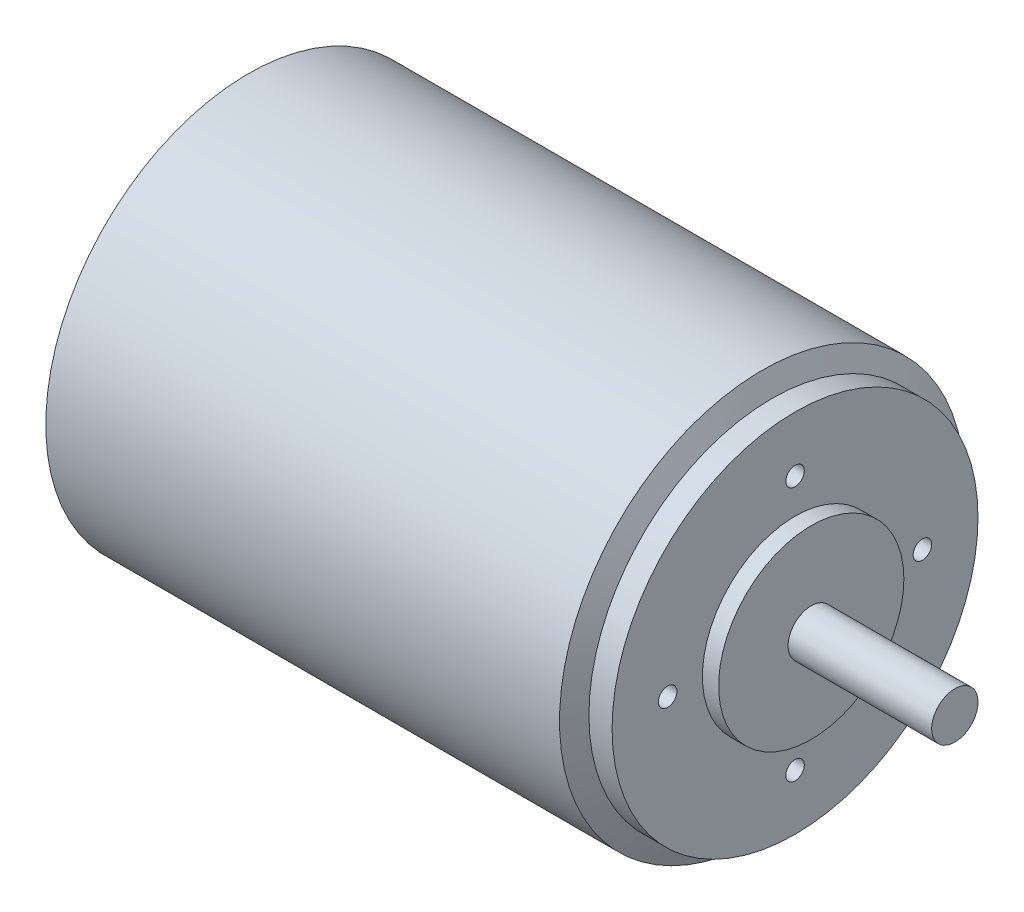
ISO-10303-21;
HEADER;
FILE_DESCRIPTION(('STEP AP214'),'2;1');
FILE_NAME('part.step','',(''),(''),'','','');
FILE_SCHEMA(('AUTOMOTIVE_DESIGN { 1 0 10303 214 1 1 1 1 }'));
ENDSEC;
DATA;
#1=APPLICATION_CONTEXT('core data for automotive mechanical design processes');
#2=APPLICATION_PROTOCOL_DEFINITION('international standard','automotive_design',2000,#1);
#3=PRODUCT_CONTEXT('',#1,'mechanical');
#4=PRODUCT('Part','Part','',(#3));
#5=PRODUCT_RELATED_PRODUCT_CATEGORY('part','',(#4));
#6=PRODUCT_DEFINITION_FORMATION('','',#4);
#7=PRODUCT_DEFINITION_CONTEXT('part definition',#1,'design');
#8=PRODUCT_DEFINITION('design','',#6,#7);
#9=PRODUCT_DEFINITION_SHAPE('','',#8);
#10=(LENGTH_UNIT() NAMED_UNIT(*) SI_UNIT(.MILLI.,.METRE.));
#11=(NAMED_UNIT(*) PLANE_ANGLE_UNIT() SI_UNIT($,.RADIAN.));
#12=(NAMED_UNIT(*) SI_UNIT($,.STERADIAN.) SOLID_ANGLE_UNIT());
#13=UNCERTAINTY_MEASURE_WITH_UNIT(LENGTH_MEASURE(1.E-05),#10,'distance_accuracy_value','');
#14=(GEOMETRIC_REPRESENTATION_CONTEXT(3) GLOBAL_UNCERTAINTY_ASSIGNED_CONTEXT((#13)) GLOBAL_UNIT_ASSIGNED_CONTEXT((#10,
#11,#12)) REPRESENTATION_CONTEXT('',''));
#15=CARTESIAN_POINT('',(0.,0.,0.));
#16=DIRECTION('',(0.,0.,1.));
#17=DIRECTION('',(1.,0.,0.));
#18=AXIS2_PLACEMENT_3D('',#15,#16,#17);
#19=CARTESIAN_POINT('',(-18.460120384871,0.,0.));
#20=DIRECTION('',(-1.,0.,0.));
#21=DIRECTION('',(0.,0.,1.));
#22=AXIS2_PLACEMENT_3D('',#19,#20,#21);
#23=PLANE('',#22);
#24=CARTESIAN_POINT('',(-18.460120384871,0.,0.));
#25=DIRECTION('',(1.,0.,0.));
#26=DIRECTION('',(0.,0.,-1.));
#27=AXIS2_PLACEMENT_3D('',#24,#25,#26);
#28=CIRCLE('',#27,2.);
#29=CARTESIAN_POINT('',(-18.460120384871,0.,-2.));
#30=VERTEX_POINT('',#29);
#31=EDGE_CURVE('E11',#30,#30,#28,.T.);
#32=ORIENTED_EDGE('',*,*,#31,.F.);
#33=EDGE_LOOP('',(#32));
#34=FACE_BOUND('',#33,.T.);
#35=ADVANCED_FACE('F36',(#34),#23,.T.);
#36=CARTESIAN_POINT('',(52.339879615129,0.,0.));
#37=DIRECTION('',(1.,0.,0.));
#38=DIRECTION('',(0.,0.,-1.));
#39=AXIS2_PLACEMENT_3D('',#36,#37,#38);
#40=CYLINDRICAL_SURFACE('',#39,2.);
#41=ORIENTED_EDGE('',*,*,#31,.T.);
#42=EDGE_LOOP('',(#41));
#43=FACE_BOUND('',#42,.T.);
#44=CARTESIAN_POINT('',(-12.160120384871,0.,0.));
#45=DIRECTION('',(1.,0.,0.));
#46=DIRECTION('',(0.,0.,-1.));
#47=AXIS2_PLACEMENT_3D('',#44,#45,#46);
#48=CIRCLE('',#47,2.);
#49=CARTESIAN_POINT('',(-12.160120384871,0.,-2.));
#50=VERTEX_POINT('',#49);
#51=EDGE_CURVE('E43',#50,#50,#48,.T.);
#52=ORIENTED_EDGE('',*,*,#51,.F.);
#53=EDGE_LOOP('',(#52));
#54=FACE_BOUND('',#53,.T.);
#55=ADVANCED_FACE('F124',(#43,#54),#40,.T.);
#56=CARTESIAN_POINT('',(-12.160120384871,0.,-2.));
#57=DIRECTION('',(-1.,0.,0.));
#58=DIRECTION('',(0.,0.,1.));
#59=AXIS2_PLACEMENT_3D('',#56,#57,#58);
#60=PLANE('',#59);
#61=ORIENTED_EDGE('',*,*,#51,.T.);
#62=EDGE_LOOP('',(#61));
#63=FACE_BOUND('',#62,.T.);
#64=CARTESIAN_POINT('',(-12.160120384871,0.,0.));
#65=DIRECTION('',(1.,0.,0.));
#66=DIRECTION('',(0.,0.,-1.));
#67=AXIS2_PLACEMENT_3D('',#64,#65,#66);
#68=CIRCLE('',#67,7.);
#69=CARTESIAN_POINT('',(-12.160120384871,0.,-7.));
#70=VERTEX_POINT('',#69);
#71=EDGE_CURVE('E116',#70,#70,#68,.T.);
#72=ORIENTED_EDGE('',*,*,#71,.F.);
#73=EDGE_LOOP('',(#72));
#74=FACE_BOUND('',#73,.T.);
#75=ADVANCED_FACE('F121',(#63,#74),#60,.T.);
#76=CARTESIAN_POINT('',(52.339879615129,0.,0.));
#77=DIRECTION('',(1.,0.,0.));
#78=DIRECTION('',(0.,0.,-1.));
#79=AXIS2_PLACEMENT_3D('',#76,#77,#78);
#80=CYLINDRICAL_SURFACE('',#79,7.);
#81=ORIENTED_EDGE('',*,*,#71,.T.);
#82=EDGE_LOOP('',(#81));
#83=FACE_BOUND('',#82,.T.);
#84=CARTESIAN_POINT('',(-8.66012038487097,0.,0.));
#85=DIRECTION('',(1.,0.,0.));
#86=DIRECTION('',(0.,0.,-1.));
#87=AXIS2_PLACEMENT_3D('',#84,#85,#86);
#88=CIRCLE('',#87,7.);
#89=CARTESIAN_POINT('',(-8.66012038487097,0.,-7.));
#90=VERTEX_POINT('',#89);
#91=EDGE_CURVE('E113',#90,#90,#88,.T.);
#92=ORIENTED_EDGE('',*,*,#91,.F.);
#93=EDGE_LOOP('',(#92));
#94=FACE_BOUND('',#93,.T.);
#95=ADVANCED_FACE('F131',(#83,#94),#80,.T.);
#96=CARTESIAN_POINT('',(-8.66012038487097,0.,-7.));
#97=DIRECTION('',(-1.,0.,0.));
#98=DIRECTION('',(0.,0.,1.));
#99=AXIS2_PLACEMENT_3D('',#96,#97,#98);
#100=PLANE('',#99);
#101=ORIENTED_EDGE('',*,*,#91,.T.);
#102=EDGE_LOOP('',(#101));
#103=FACE_BOUND('',#102,.T.);
#104=CARTESIAN_POINT('',(-8.66012038487097,0.,0.));
#105=DIRECTION('',(1.,0.,0.));
#106=DIRECTION('',(0.,0.,-1.));
#107=AXIS2_PLACEMENT_3D('',#104,#105,#106);
#108=CIRCLE('',#107,17.5);
#109=CARTESIAN_POINT('',(-8.66012038487097,0.,-17.5));
#110=VERTEX_POINT('',#109);
#111=EDGE_CURVE('E110',#110,#110,#108,.T.);
#112=ORIENTED_EDGE('',*,*,#111,.F.);
#113=EDGE_LOOP('',(#112));
#114=FACE_BOUND('',#113,.T.);
#115=ADVANCED_FACE('F137',(#103,#114),#100,.T.);
#116=CARTESIAN_POINT('',(52.339879615129,0.,0.));
#117=DIRECTION('',(1.,0.,0.));
#118=DIRECTION('',(0.,0.,-1.));
#119=AXIS2_PLACEMENT_3D('',#116,#117,#118);
#120=CYLINDRICAL_SURFACE('',#119,17.5);
#121=ORIENTED_EDGE('',*,*,#111,.T.);
#122=EDGE_LOOP('',(#121));
#123=FACE_BOUND('',#122,.T.);
#124=CARTESIAN_POINT('',(35.7034887831074,0.,0.));
#125=DIRECTION('',(1.,0.,0.));
#126=DIRECTION('',(0.,0.,-1.));
#127=AXIS2_PLACEMENT_3D('',#124,#125,#126);
#128=CIRCLE('',#127,17.5);
#129=CARTESIAN_POINT('',(35.7034887831074,0.,-17.5));
#130=VERTEX_POINT('',#129);
#131=EDGE_CURVE('E107',#130,#130,#128,.T.);
#132=ORIENTED_EDGE('',*,*,#131,.F.);
#133=EDGE_LOOP('',(#132));
#134=FACE_BOUND('',#133,.T.);
#135=ADVANCED_FACE('F141',(#123,#134),#120,.T.);
#136=CARTESIAN_POINT('',(36.539879615129,0.,0.));
#137=DIRECTION('',(-1.,0.,0.));
#138=DIRECTION('',(0.,0.,1.));
#139=AXIS2_PLACEMENT_3D('',#136,#137,#138);
#140=CONICAL_SURFACE('',#139,15.8,1.113573517235);
#141=ORIENTED_EDGE('',*,*,#131,.T.);
#142=EDGE_LOOP('',(#141));
#143=FACE_BOUND('',#142,.T.);
#144=CARTESIAN_POINT('',(36.539879615129,0.,0.));
#145=DIRECTION('',(1.,0.,0.));
#146=DIRECTION('',(0.,0.,-1.));
#147=AXIS2_PLACEMENT_3D('',#144,#145,#146);
#148=CIRCLE('',#147,15.8);
#149=CARTESIAN_POINT('',(36.539879615129,0.,-15.8));
#150=VERTEX_POINT('',#149);
#151=EDGE_CURVE('E104',#150,#150,#148,.T.);
#152=ORIENTED_EDGE('',*,*,#151,.F.);
#153=EDGE_LOOP('',(#152));
#154=FACE_BOUND('',#153,.T.);
#155=ADVANCED_FACE('F145',(#143,#154),#140,.T.);
#156=CARTESIAN_POINT('',(52.339879615129,0.,0.));
#157=DIRECTION('',(1.,0.,0.));
#158=DIRECTION('',(0.,0.,-1.));
#159=AXIS2_PLACEMENT_3D('',#156,#157,#158);
#160=CYLINDRICAL_SURFACE('',#159,15.8);
#161=ORIENTED_EDGE('',*,*,#151,.T.);
#162=EDGE_LOOP('',(#161));
#163=FACE_BOUND('',#162,.T.);
#164=CARTESIAN_POINT('',(38.539879615129,0.,0.));
#165=DIRECTION('',(1.,0.,0.));
#166=DIRECTION('',(0.,0.,-1.));
#167=AXIS2_PLACEMENT_3D('',#164,#165,#166);
#168=CIRCLE('',#167,15.8);
#169=CARTESIAN_POINT('',(38.539879615129,0.,-15.8));
#170=VERTEX_POINT('',#169);
#171=EDGE_CURVE('E101',#170,#170,#168,.T.);
#172=ORIENTED_EDGE('',*,*,#171,.F.);
#173=EDGE_LOOP('',(#172));
#174=FACE_BOUND('',#173,.T.);
#175=ADVANCED_FACE('F149',(#163,#174),#160,.T.);
#176=CARTESIAN_POINT('',(38.539879615129,0.,-15.8));
#177=DIRECTION('',(1.,0.,0.));
#178=DIRECTION('',(0.,0.,-1.));
#179=AXIS2_PLACEMENT_3D('',#176,#177,#178);
#180=PLANE('',#179);
#181=CARTESIAN_POINT('',(38.539879615129,-11.,-1.1521895091661E-13));
#182=DIRECTION('',(1.,0.,0.));
#183=DIRECTION('',(0.,0.,-1.));
#184=AXIS2_PLACEMENT_3D('',#181,#182,#183);
#185=CIRCLE('',#184,0.79999999999999);
#186=CARTESIAN_POINT('',(38.539879615129,-11.,-0.800000000000105));
#187=VERTEX_POINT('',#186);
#188=EDGE_CURVE('E67',#187,#187,#185,.T.);
#189=ORIENTED_EDGE('',*,*,#188,.F.);
#190=EDGE_LOOP('',(#189));
#191=FACE_BOUND('',#190,.T.);
#192=CARTESIAN_POINT('',(38.539879615129,0.,11.));
#193=DIRECTION('',(1.,0.,0.));
#194=DIRECTION('',(0.,0.,-1.));
#195=AXIS2_PLACEMENT_3D('',#192,#193,#194);
#196=CIRCLE('',#195,0.79999999999999);
#197=CARTESIAN_POINT('',(38.539879615129,0.,10.2));
#198=VERTEX_POINT('',#197);
#199=EDGE_CURVE('E66',#198,#198,#196,.T.);
#200=ORIENTED_EDGE('',*,*,#199,.F.);
#201=EDGE_LOOP('',(#200));
#202=FACE_BOUND('',#201,.T.);
#203=CARTESIAN_POINT('',(38.539879615129,11.,0.));
#204=DIRECTION('',(1.,0.,0.));
#205=DIRECTION('',(0.,0.,-1.));
#206=AXIS2_PLACEMENT_3D('',#203,#204,#205);
#207=CIRCLE('',#206,0.79999999999999);
#208=CARTESIAN_POINT('',(38.539879615129,11.,-0.799999999999952));
#209=VERTEX_POINT('',#208);
#210=EDGE_CURVE('E77',#209,#209,#207,.T.);
#211=ORIENTED_EDGE('',*,*,#210,.F.);
#212=EDGE_LOOP('',(#211));
#213=FACE_BOUND('',#212,.T.);
#214=CARTESIAN_POINT('',(38.539879615129,0.,-11.));
#215=DIRECTION('',(1.,0.,0.));
#216=DIRECTION('',(0.,0.,-1.));
#217=AXIS2_PLACEMENT_3D('',#214,#215,#216);
#218=CIRCLE('',#217,0.79999999999999);
#219=CARTESIAN_POINT('',(38.539879615129,0.,-11.8));
#220=VERTEX_POINT('',#219);
#221=EDGE_CURVE('E83',#220,#220,#218,.T.);
#222=ORIENTED_EDGE('',*,*,#221,.F.);
#223=EDGE_LOOP('',(#222));
#224=FACE_BOUND('',#223,.T.);
#225=ORIENTED_EDGE('',*,*,#171,.T.);
#226=EDGE_LOOP('',(#225));
#227=FACE_BOUND('',#226,.T.);
#228=CARTESIAN_POINT('',(38.539879615129,0.,0.));
#229=DIRECTION('',(1.,0.,0.));
#230=DIRECTION('',(0.,0.,-1.));
#231=AXIS2_PLACEMENT_3D('',#228,#229,#230);
#232=CIRCLE('',#231,8.);
#233=CARTESIAN_POINT('',(38.539879615129,0.,-8.));
#234=VERTEX_POINT('',#233);
#235=EDGE_CURVE('E98',#234,#234,#232,.T.);
#236=ORIENTED_EDGE('',*,*,#235,.F.);
#237=EDGE_LOOP('',(#236));
#238=FACE_BOUND('',#237,.T.);
#239=ADVANCED_FACE('F153',(#191,#202,#213,#224,#227,#238),#180,.T.);
#240=CARTESIAN_POINT('',(52.339879615129,0.,0.));
#241=DIRECTION('',(1.,0.,0.));
#242=DIRECTION('',(0.,0.,-1.));
#243=AXIS2_PLACEMENT_3D('',#240,#241,#242);
#244=CYLINDRICAL_SURFACE('',#243,8.);
#245=ORIENTED_EDGE('',*,*,#235,.T.);
#246=EDGE_LOOP('',(#245));
#247=FACE_BOUND('',#246,.T.);
#248=CARTESIAN_POINT('',(39.939879615129,0.,0.));
#249=DIRECTION('',(1.,0.,0.));
#250=DIRECTION('',(0.,0.,-1.));
#251=AXIS2_PLACEMENT_3D('',#248,#249,#250);
#252=CIRCLE('',#251,8.);
#253=CARTESIAN_POINT('',(39.939879615129,0.,-8.));
#254=VERTEX_POINT('',#253);
#255=EDGE_CURVE('E95',#254,#254,#252,.T.);
#256=ORIENTED_EDGE('',*,*,#255,.F.);
#257=EDGE_LOOP('',(#256));
#258=FACE_BOUND('',#257,.T.);
#259=ADVANCED_FACE('F157',(#247,#258),#244,.T.);
#260=CARTESIAN_POINT('',(39.939879615129,0.,-8.));
#261=DIRECTION('',(1.,0.,0.));
#262=DIRECTION('',(0.,0.,-1.));
#263=AXIS2_PLACEMENT_3D('',#260,#261,#262);
#264=PLANE('',#263);
#265=ORIENTED_EDGE('',*,*,#255,.T.);
#266=EDGE_LOOP('',(#265));
#267=FACE_BOUND('',#266,.T.);
#268=CARTESIAN_POINT('',(39.939879615129,0.,0.));
#269=DIRECTION('',(1.,0.,0.));
#270=DIRECTION('',(0.,0.,-1.));
#271=AXIS2_PLACEMENT_3D('',#268,#269,#270);
#272=CIRCLE('',#271,2.);
#273=CARTESIAN_POINT('',(39.939879615129,0.,-2.));
#274=VERTEX_POINT('',#273);
#275=EDGE_CURVE('E92',#274,#274,#272,.T.);
#276=ORIENTED_EDGE('',*,*,#275,.F.);
#277=EDGE_LOOP('',(#276));
#278=FACE_BOUND('',#277,.T.);
#279=ADVANCED_FACE('F161',(#267,#278),#264,.T.);
#280=CARTESIAN_POINT('',(52.339879615129,0.,0.));
#281=DIRECTION('',(1.,0.,0.));
#282=DIRECTION('',(0.,0.,-1.));
#283=AXIS2_PLACEMENT_3D('',#280,#281,#282);
#284=CYLINDRICAL_SURFACE('',#283,2.);
#285=ORIENTED_EDGE('',*,*,#275,.T.);
#286=EDGE_LOOP('',(#285));
#287=FACE_BOUND('',#286,.T.);
#288=CARTESIAN_POINT('',(52.339879615129,0.,0.));
#289=DIRECTION('',(1.,0.,0.));
#290=DIRECTION('',(0.,0.,-1.));
#291=AXIS2_PLACEMENT_3D('',#288,#289,#290);
#292=CIRCLE('',#291,2.);
#293=CARTESIAN_POINT('',(52.339879615129,0.,-2.));
#294=VERTEX_POINT('',#293);
#295=EDGE_CURVE('E89',#294,#294,#292,.T.);
#296=ORIENTED_EDGE('',*,*,#295,.F.);
#297=EDGE_LOOP('',(#296));
#298=FACE_BOUND('',#297,.T.);
#299=ADVANCED_FACE('F165',(#287,#298),#284,.T.);
#300=CARTESIAN_POINT('',(52.339879615129,0.,-2.));
#301=DIRECTION('',(1.,0.,0.));
#302=DIRECTION('',(0.,0.,-1.));
#303=AXIS2_PLACEMENT_3D('',#300,#301,#302);
#304=PLANE('',#303);
#305=ORIENTED_EDGE('',*,*,#295,.T.);
#306=EDGE_LOOP('',(#305));
#307=FACE_BOUND('',#306,.T.);
#308=ADVANCED_FACE('F169',(#307),#304,.T.);
#309=CARTESIAN_POINT('',(33.839879615129,0.,-11.));
#310=DIRECTION('',(1.,0.,0.));
#311=DIRECTION('',(0.,0.,-1.));
#312=AXIS2_PLACEMENT_3D('',#309,#310,#311);
#313=CONICAL_SURFACE('',#312,0.799999999999988,1.02974425867664);
#314=CARTESIAN_POINT('',(33.359191119907,0.,-11.));
#315=VERTEX_POINT('',#314);
#316=VERTEX_LOOP('',#315);
#317=FACE_BOUND('',#316,.T.);
#318=CARTESIAN_POINT('',(33.839879615129,0.,-11.));
#319=DIRECTION('',(1.,0.,0.));
#320=DIRECTION('',(0.,0.,-1.));
#321=AXIS2_PLACEMENT_3D('',#318,#319,#320);
#322=CIRCLE('',#321,0.799999999999988);
#323=CARTESIAN_POINT('',(33.839879615129,0.,-11.8));
#324=VERTEX_POINT('',#323);
#325=EDGE_CURVE('E86',#324,#324,#322,.T.);
#326=ORIENTED_EDGE('',*,*,#325,.T.);
#327=EDGE_LOOP('',(#326));
#328=FACE_BOUND('',#327,.T.);
#329=ADVANCED_FACE('F173',(#317,#328),#313,.F.);
#330=CARTESIAN_POINT('',(38.539879615129,0.,-11.));
#331=DIRECTION('',(1.,0.,0.));
#332=DIRECTION('',(0.,0.,-1.));
#333=AXIS2_PLACEMENT_3D('',#330,#331,#332);
#334=CYLINDRICAL_SURFACE('',#333,0.799999999999989);
#335=ORIENTED_EDGE('',*,*,#325,.F.);
#336=EDGE_LOOP('',(#335));
#337=FACE_BOUND('',#336,.T.);
#338=ORIENTED_EDGE('',*,*,#221,.T.);
#339=EDGE_LOOP('',(#338));
#340=FACE_BOUND('',#339,.T.);
#341=ADVANCED_FACE('F177',(#337,#340),#334,.F.);
#342=CARTESIAN_POINT('',(33.839879615129,11.,0.));
#343=DIRECTION('',(1.,0.,0.));
#344=DIRECTION('',(0.,0.,-1.));
#345=AXIS2_PLACEMENT_3D('',#342,#343,#344);
#346=CONICAL_SURFACE('',#345,0.799999999999988,1.02974425867664);
#347=CARTESIAN_POINT('',(33.359191119907,11.,0.));
#348=VERTEX_POINT('',#347);
#349=VERTEX_LOOP('',#348);
#350=FACE_BOUND('',#349,.T.);
#351=CARTESIAN_POINT('',(33.839879615129,11.,0.));
#352=DIRECTION('',(1.,0.,0.));
#353=DIRECTION('',(0.,0.,-1.));
#354=AXIS2_PLACEMENT_3D('',#351,#352,#353);
#355=CIRCLE('',#354,0.799999999999988);
#356=CARTESIAN_POINT('',(33.839879615129,11.,-0.79999999999995));
#357=VERTEX_POINT('',#356);
#358=EDGE_CURVE('E80',#357,#357,#355,.T.);
#359=ORIENTED_EDGE('',*,*,#358,.T.);
#360=EDGE_LOOP('',(#359));
#361=FACE_BOUND('',#360,.T.);
#362=ADVANCED_FACE('F180',(#350,#361),#346,.F.);
#363=CARTESIAN_POINT('',(38.539879615129,11.,0.));
#364=DIRECTION('',(1.,0.,0.));
#365=DIRECTION('',(0.,0.,-1.));
#366=AXIS2_PLACEMENT_3D('',#363,#364,#365);
#367=CYLINDRICAL_SURFACE('',#366,0.799999999999989);
#368=ORIENTED_EDGE('',*,*,#358,.F.);
#369=EDGE_LOOP('',(#368));
#370=FACE_BOUND('',#369,.T.);
#371=ORIENTED_EDGE('',*,*,#210,.T.);
#372=EDGE_LOOP('',(#371));
#373=FACE_BOUND('',#372,.T.);
#374=ADVANCED_FACE('F184',(#370,#373),#367,.F.);
#375=CARTESIAN_POINT('',(33.839879615129,0.,11.));
#376=DIRECTION('',(1.,0.,0.));
#377=DIRECTION('',(0.,0.,-1.));
#378=AXIS2_PLACEMENT_3D('',#375,#376,#377);
#379=CONICAL_SURFACE('',#378,0.799999999999988,1.02974425867664);
#380=CARTESIAN_POINT('',(33.359191119907,0.,11.));
#381=VERTEX_POINT('',#380);
#382=VERTEX_LOOP('',#381);
#383=FACE_BOUND('',#382,.T.);
#384=CARTESIAN_POINT('',(33.839879615129,0.,11.));
#385=DIRECTION('',(1.,0.,0.));
#386=DIRECTION('',(0.,0.,-1.));
#387=AXIS2_PLACEMENT_3D('',#384,#385,#386);
#388=CIRCLE('',#387,0.799999999999988);
#389=CARTESIAN_POINT('',(33.839879615129,0.,10.2));
#390=VERTEX_POINT('',#389);
#391=EDGE_CURVE('E70',#390,#390,#388,.T.);
#392=ORIENTED_EDGE('',*,*,#391,.T.);
#393=EDGE_LOOP('',(#392));
#394=FACE_BOUND('',#393,.T.);
#395=ADVANCED_FACE('F187',(#383,#394),#379,.F.);
#396=CARTESIAN_POINT('',(38.539879615129,0.,11.));
#397=DIRECTION('',(1.,0.,0.));
#398=DIRECTION('',(0.,0.,-1.));
#399=AXIS2_PLACEMENT_3D('',#396,#397,#398);
#400=CYLINDRICAL_SURFACE('',#399,0.799999999999989);
#401=ORIENTED_EDGE('',*,*,#391,.F.);
#402=EDGE_LOOP('',(#401));
#403=FACE_BOUND('',#402,.T.);
#404=ORIENTED_EDGE('',*,*,#199,.T.);
#405=EDGE_LOOP('',(#404));
#406=FACE_BOUND('',#405,.T.);
#407=ADVANCED_FACE('F60',(#403,#406),#400,.F.);
#408=CARTESIAN_POINT('',(33.839879615129,-11.,-1.1521895091661E-13));
#409=DIRECTION('',(1.,0.,0.));
#410=DIRECTION('',(0.,0.,-1.));
#411=AXIS2_PLACEMENT_3D('',#408,#409,#410);
#412=CONICAL_SURFACE('',#411,0.799999999999988,1.02974425867664);
#413=CARTESIAN_POINT('',(33.359191119907,-11.,-1.1521895091661E-13));
#414=VERTEX_POINT('',#413);
#415=VERTEX_LOOP('',#414);
#416=FACE_BOUND('',#415,.T.);
#417=CARTESIAN_POINT('',(33.839879615129,-11.,-1.1521895091661E-13));
#418=DIRECTION('',(1.,0.,0.));
#419=DIRECTION('',(0.,0.,-1.));
#420=AXIS2_PLACEMENT_3D('',#417,#418,#419);
#421=CIRCLE('',#420,0.799999999999988);
#422=CARTESIAN_POINT('',(33.839879615129,-11.,-0.800000000000104));
#423=VERTEX_POINT('',#422);
#424=EDGE_CURVE('E64',#423,#423,#421,.T.);
#425=ORIENTED_EDGE('',*,*,#424,.T.);
#426=EDGE_LOOP('',(#425));
#427=FACE_BOUND('',#426,.T.);
#428=ADVANCED_FACE('F56',(#416,#427),#412,.F.);
#429=CARTESIAN_POINT('',(38.539879615129,-11.,-1.1521895091661E-13));
#430=DIRECTION('',(1.,0.,0.));
#431=DIRECTION('',(0.,0.,-1.));
#432=AXIS2_PLACEMENT_3D('',#429,#430,#431);
#433=CYLINDRICAL_SURFACE('',#432,0.799999999999989);
#434=ORIENTED_EDGE('',*,*,#424,.F.);
#435=EDGE_LOOP('',(#434));
#436=FACE_BOUND('',#435,.T.);
#437=ORIENTED_EDGE('',*,*,#188,.T.);
#438=EDGE_LOOP('',(#437));
#439=FACE_BOUND('',#438,.T.);
#440=ADVANCED_FACE('F59',(#436,#439),#433,.F.);
#441=CLOSED_SHELL('',(#35,#55,#75,#95,#115,#135,#155,#175,#239,#259,#279,#299,#308,#329,#341,
#362,#374,#395,#407,#428,#440));
#442=MANIFOLD_SOLID_BREP('B2',#441);
#443=ADVANCED_BREP_SHAPE_REPRESENTATION('',(#18,#442),#14);
#444=SHAPE_DEFINITION_REPRESENTATION(#9,#443);
ENDSEC;
END-ISO-10303-21;
